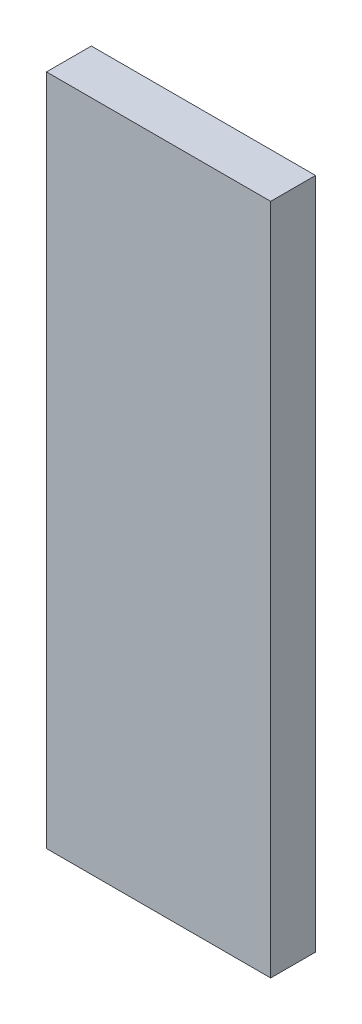
ISO-10303-21;
HEADER;
FILE_DESCRIPTION(('STEP AP214'),'2;1');
FILE_NAME('part.step','',(''),(''),'','','');
FILE_SCHEMA(('AUTOMOTIVE_DESIGN { 1 0 10303 214 1 1 1 1 }'));
ENDSEC;
DATA;
#1=APPLICATION_CONTEXT('core data for automotive mechanical design processes');
#2=APPLICATION_PROTOCOL_DEFINITION('international standard','automotive_design',2000,#1);
#3=PRODUCT_CONTEXT('',#1,'mechanical');
#4=PRODUCT('Part','Part','',(#3));
#5=PRODUCT_RELATED_PRODUCT_CATEGORY('part','',(#4));
#6=PRODUCT_DEFINITION_FORMATION('','',#4);
#7=PRODUCT_DEFINITION_CONTEXT('part definition',#1,'design');
#8=PRODUCT_DEFINITION('design','',#6,#7);
#9=PRODUCT_DEFINITION_SHAPE('','',#8);
#10=(LENGTH_UNIT() NAMED_UNIT(*) SI_UNIT(.MILLI.,.METRE.));
#11=(NAMED_UNIT(*) PLANE_ANGLE_UNIT() SI_UNIT($,.RADIAN.));
#12=(NAMED_UNIT(*) SI_UNIT($,.STERADIAN.) SOLID_ANGLE_UNIT());
#13=UNCERTAINTY_MEASURE_WITH_UNIT(LENGTH_MEASURE(1.E-05),#10,'distance_accuracy_value','');
#14=(GEOMETRIC_REPRESENTATION_CONTEXT(3) GLOBAL_UNCERTAINTY_ASSIGNED_CONTEXT((#13)) GLOBAL_UNIT_ASSIGNED_CONTEXT((#10,
#11,#12)) REPRESENTATION_CONTEXT('',''));
#15=CARTESIAN_POINT('',(0.,0.,0.));
#16=DIRECTION('',(0.,0.,1.));
#17=DIRECTION('',(1.,0.,0.));
#18=AXIS2_PLACEMENT_3D('',#15,#16,#17);
#19=CARTESIAN_POINT('',(-43.7639836357608,10.3150507940117,1.));
#20=DIRECTION('',(1.,0.,0.));
#21=DIRECTION('',(0.,0.,-1.));
#22=AXIS2_PLACEMENT_3D('',#19,#20,#21);
#23=PLANE('',#22);
#24=DIRECTION('',(0.,-1.,0.));
#25=VECTOR('',#24,1.);
#26=CARTESIAN_POINT('',(-43.7639836357608,10.3150507940117,0.));
#27=LINE('',#26,#25);
#28=CARTESIAN_POINT('',(-43.7639836357608,25.3150507940117,0.));
#29=VERTEX_POINT('',#28);
#30=CARTESIAN_POINT('',(-43.7639836357608,10.3150507940117,0.));
#31=VERTEX_POINT('',#30);
#32=EDGE_CURVE('E96',#29,#31,#27,.T.);
#33=ORIENTED_EDGE('',*,*,#32,.T.);
#34=DIRECTION('',(0.,0.,-1.));
#35=VECTOR('',#34,1.);
#36=CARTESIAN_POINT('',(-43.7639836357608,10.3150507940117,1.));
#37=LINE('',#36,#35);
#38=CARTESIAN_POINT('',(-43.7639836357608,10.3150507940117,1.));
#39=VERTEX_POINT('',#38);
#40=EDGE_CURVE('E11',#39,#31,#37,.T.);
#41=ORIENTED_EDGE('',*,*,#40,.F.);
#42=DIRECTION('',(0.,-1.,0.));
#43=VECTOR('',#42,1.);
#44=CARTESIAN_POINT('',(-43.7639836357608,10.3150507940117,1.));
#45=LINE('',#44,#43);
#46=CARTESIAN_POINT('',(-43.7639836357608,25.3150507940117,1.));
#47=VERTEX_POINT('',#46);
#48=EDGE_CURVE('E84',#47,#39,#45,.T.);
#49=ORIENTED_EDGE('',*,*,#48,.F.);
#50=DIRECTION('',(0.,0.,-1.));
#51=VECTOR('',#50,1.);
#52=CARTESIAN_POINT('',(-43.7639836357608,25.3150507940117,1.));
#53=LINE('',#52,#51);
#54=EDGE_CURVE('E92',#47,#29,#53,.T.);
#55=ORIENTED_EDGE('',*,*,#54,.T.);
#56=EDGE_LOOP('',(#33,#41,#49,#55));
#57=FACE_BOUND('',#56,.T.);
#58=ADVANCED_FACE('F33',(#57),#23,.F.);
#59=CARTESIAN_POINT('',(-43.7639836357608,10.3150507940117,1.));
#60=DIRECTION('',(0.,1.,0.));
#61=DIRECTION('',(0.,0.,1.));
#62=AXIS2_PLACEMENT_3D('',#59,#60,#61);
#63=PLANE('',#62);
#64=DIRECTION('',(1.,0.,0.));
#65=VECTOR('',#64,1.);
#66=CARTESIAN_POINT('',(-43.7639836357608,10.3150507940117,0.));
#67=LINE('',#66,#65);
#68=CARTESIAN_POINT('',(-38.7639836357608,10.3150507940117,0.));
#69=VERTEX_POINT('',#68);
#70=EDGE_CURVE('E88',#31,#69,#67,.T.);
#71=ORIENTED_EDGE('',*,*,#70,.T.);
#72=DIRECTION('',(0.,0.,-1.));
#73=VECTOR('',#72,1.);
#74=CARTESIAN_POINT('',(-38.7639836357608,10.3150507940117,1.));
#75=LINE('',#74,#73);
#76=CARTESIAN_POINT('',(-38.7639836357608,10.3150507940117,1.));
#77=VERTEX_POINT('',#76);
#78=EDGE_CURVE('E41',#77,#69,#75,.T.);
#79=ORIENTED_EDGE('',*,*,#78,.F.);
#80=DIRECTION('',(1.,0.,0.));
#81=VECTOR('',#80,1.);
#82=CARTESIAN_POINT('',(-43.7639836357608,10.3150507940117,1.));
#83=LINE('',#82,#81);
#84=EDGE_CURVE('E79',#39,#77,#83,.T.);
#85=ORIENTED_EDGE('',*,*,#84,.F.);
#86=ORIENTED_EDGE('',*,*,#40,.T.);
#87=EDGE_LOOP('',(#71,#79,#85,#86));
#88=FACE_BOUND('',#87,.T.);
#89=ADVANCED_FACE('F87',(#88),#63,.F.);
#90=CARTESIAN_POINT('',(-38.7639836357608,10.3150507940117,1.));
#91=DIRECTION('',(-1.,0.,0.));
#92=DIRECTION('',(0.,0.,1.));
#93=AXIS2_PLACEMENT_3D('',#90,#91,#92);
#94=PLANE('',#93);
#95=DIRECTION('',(0.,1.,0.));
#96=VECTOR('',#95,1.);
#97=CARTESIAN_POINT('',(-38.7639836357608,10.3150507940117,0.));
#98=LINE('',#97,#96);
#99=CARTESIAN_POINT('',(-38.7639836357608,25.3150507940117,0.));
#100=VERTEX_POINT('',#99);
#101=EDGE_CURVE('E66',#69,#100,#98,.T.);
#102=ORIENTED_EDGE('',*,*,#101,.T.);
#103=DIRECTION('',(0.,0.,-1.));
#104=VECTOR('',#103,1.);
#105=CARTESIAN_POINT('',(-38.7639836357608,25.3150507940117,1.));
#106=LINE('',#105,#104);
#107=CARTESIAN_POINT('',(-38.7639836357608,25.3150507940117,1.));
#108=VERTEX_POINT('',#107);
#109=EDGE_CURVE('E89',#108,#100,#106,.T.);
#110=ORIENTED_EDGE('',*,*,#109,.F.);
#111=DIRECTION('',(0.,1.,0.));
#112=VECTOR('',#111,1.);
#113=CARTESIAN_POINT('',(-38.7639836357608,10.3150507940117,1.));
#114=LINE('',#113,#112);
#115=EDGE_CURVE('E82',#77,#108,#114,.T.);
#116=ORIENTED_EDGE('',*,*,#115,.F.);
#117=ORIENTED_EDGE('',*,*,#78,.T.);
#118=EDGE_LOOP('',(#102,#110,#116,#117));
#119=FACE_BOUND('',#118,.T.);
#120=ADVANCED_FACE('F90',(#119),#94,.F.);
#121=CARTESIAN_POINT('',(-43.7639836357608,25.3150507940117,1.));
#122=DIRECTION('',(0.,-1.,0.));
#123=DIRECTION('',(0.,0.,-1.));
#124=AXIS2_PLACEMENT_3D('',#121,#122,#123);
#125=PLANE('',#124);
#126=DIRECTION('',(-1.,0.,0.));
#127=VECTOR('',#126,1.);
#128=CARTESIAN_POINT('',(-43.7639836357608,25.3150507940117,0.));
#129=LINE('',#128,#127);
#130=EDGE_CURVE('E72',#100,#29,#129,.T.);
#131=ORIENTED_EDGE('',*,*,#130,.T.);
#132=ORIENTED_EDGE('',*,*,#54,.F.);
#133=DIRECTION('',(-1.,0.,0.));
#134=VECTOR('',#133,1.);
#135=CARTESIAN_POINT('',(-43.7639836357608,25.3150507940117,1.));
#136=LINE('',#135,#134);
#137=EDGE_CURVE('E49',#108,#47,#136,.T.);
#138=ORIENTED_EDGE('',*,*,#137,.F.);
#139=ORIENTED_EDGE('',*,*,#109,.T.);
#140=EDGE_LOOP('',(#131,#132,#138,#139));
#141=FACE_BOUND('',#140,.T.);
#142=ADVANCED_FACE('F103',(#141),#125,.F.);
#143=CARTESIAN_POINT('',(0.,0.,1.));
#144=DIRECTION('',(0.,0.,-1.));
#145=DIRECTION('',(-1.,0.,0.));
#146=AXIS2_PLACEMENT_3D('',#143,#144,#145);
#147=PLANE('',#146);
#148=ORIENTED_EDGE('',*,*,#48,.T.);
#149=ORIENTED_EDGE('',*,*,#84,.T.);
#150=ORIENTED_EDGE('',*,*,#115,.T.);
#151=ORIENTED_EDGE('',*,*,#137,.T.);
#152=EDGE_LOOP('',(#148,#149,#150,#151));
#153=FACE_BOUND('',#152,.T.);
#154=ADVANCED_FACE('F80',(#153),#147,.F.);
#155=CARTESIAN_POINT('',(0.,0.,0.));
#156=DIRECTION('',(0.,0.,-1.));
#157=DIRECTION('',(-1.,0.,0.));
#158=AXIS2_PLACEMENT_3D('',#155,#156,#157);
#159=PLANE('',#158);
#160=ORIENTED_EDGE('',*,*,#32,.F.);
#161=ORIENTED_EDGE('',*,*,#130,.F.);
#162=ORIENTED_EDGE('',*,*,#101,.F.);
#163=ORIENTED_EDGE('',*,*,#70,.F.);
#164=EDGE_LOOP('',(#160,#161,#162,#163));
#165=FACE_BOUND('',#164,.T.);
#166=ADVANCED_FACE('F106',(#165),#159,.T.);
#167=CLOSED_SHELL('',(#58,#89,#120,#142,#154,#166));
#168=MANIFOLD_SOLID_BREP('B2',#167);
#169=ADVANCED_BREP_SHAPE_REPRESENTATION('',(#18,#168),#14);
#170=SHAPE_DEFINITION_REPRESENTATION(#9,#169);
ENDSEC;
END-ISO-10303-21;
